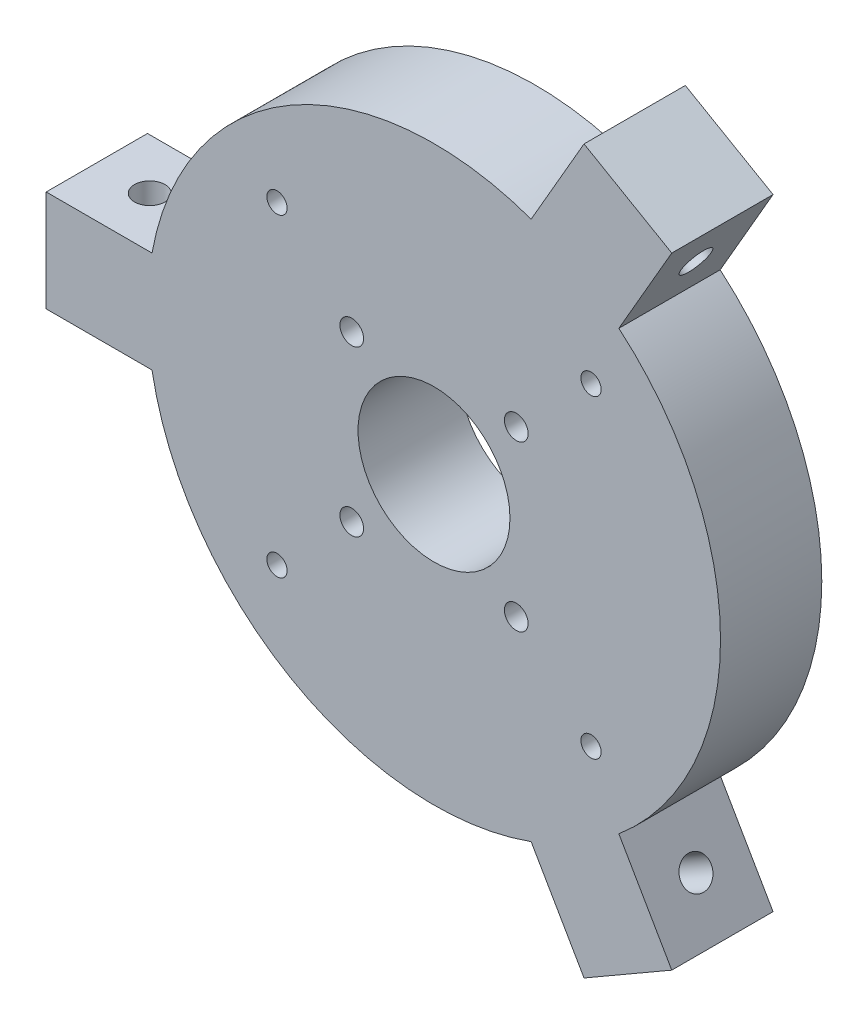
ISO-10303-21;
HEADER;
FILE_DESCRIPTION(('STEP AP214'),'2;1');
FILE_NAME('part.step','',(''),(''),'','','');
FILE_SCHEMA(('AUTOMOTIVE_DESIGN { 1 0 10303 214 1 1 1 1 }'));
ENDSEC;
DATA;
#1=APPLICATION_CONTEXT('core data for automotive mechanical design processes');
#2=APPLICATION_PROTOCOL_DEFINITION('international standard','automotive_design',2000,#1);
#3=PRODUCT_CONTEXT('',#1,'mechanical');
#4=PRODUCT('Part','Part','',(#3));
#5=PRODUCT_RELATED_PRODUCT_CATEGORY('part','',(#4));
#6=PRODUCT_DEFINITION_FORMATION('','',#4);
#7=PRODUCT_DEFINITION_CONTEXT('part definition',#1,'design');
#8=PRODUCT_DEFINITION('design','',#6,#7);
#9=PRODUCT_DEFINITION_SHAPE('','',#8);
#10=(LENGTH_UNIT() NAMED_UNIT(*) SI_UNIT(.MILLI.,.METRE.));
#11=(NAMED_UNIT(*) PLANE_ANGLE_UNIT() SI_UNIT($,.RADIAN.));
#12=(NAMED_UNIT(*) SI_UNIT($,.STERADIAN.) SOLID_ANGLE_UNIT());
#13=UNCERTAINTY_MEASURE_WITH_UNIT(LENGTH_MEASURE(1.E-05),#10,'distance_accuracy_value','');
#14=(GEOMETRIC_REPRESENTATION_CONTEXT(3) GLOBAL_UNCERTAINTY_ASSIGNED_CONTEXT((#13)) GLOBAL_UNIT_ASSIGNED_CONTEXT((#10,
#11,#12)) REPRESENTATION_CONTEXT('',''));
#15=CARTESIAN_POINT('',(0.,0.,0.));
#16=DIRECTION('',(0.,0.,1.));
#17=DIRECTION('',(1.,0.,0.));
#18=AXIS2_PLACEMENT_3D('',#15,#16,#17);
#19=CARTESIAN_POINT('',(0.,0.,20.));
#20=DIRECTION('',(0.,0.,-1.));
#21=DIRECTION('',(-1.,0.,0.));
#22=AXIS2_PLACEMENT_3D('',#19,#20,#21);
#23=CYLINDRICAL_SURFACE('',#22,56.5685424949238);
#24=DIRECTION('',(0.,0.,-1.));
#25=VECTOR('',#24,1.);
#26=CARTESIAN_POINT('',(36.4990758519941,-43.2182538049651,20.));
#27=LINE('',#26,#25);
#28=CARTESIAN_POINT('',(36.499075851994,-43.2182538049651,20.));
#29=VERTEX_POINT('',#28);
#30=CARTESIAN_POINT('',(36.499075851994,-43.2182538049651,0.));
#31=VERTEX_POINT('',#30);
#32=EDGE_CURVE('E255',#29,#31,#27,.T.);
#33=ORIENTED_EDGE('',*,*,#32,.T.);
#34=CARTESIAN_POINT('',(0.,0.,0.));
#35=DIRECTION('',(0.,0.,-1.));
#36=DIRECTION('',(-1.,0.,0.));
#37=AXIS2_PLACEMENT_3D('',#34,#35,#36);
#38=CIRCLE('',#37,56.5685424949238);
#39=CARTESIAN_POINT('',(36.4990758519947,43.2182538049646,0.));
#40=VERTEX_POINT('',#39);
#41=EDGE_CURVE('E433',#40,#31,#38,.T.);
#42=ORIENTED_EDGE('',*,*,#41,.F.);
#43=DIRECTION('',(0.,0.,-1.));
#44=VECTOR('',#43,1.);
#45=CARTESIAN_POINT('',(36.4990758519947,43.2182538049646,20.));
#46=LINE('',#45,#44);
#47=CARTESIAN_POINT('',(36.4990758519946,43.2182538049647,20.));
#48=VERTEX_POINT('',#47);
#49=EDGE_CURVE('E387',#48,#40,#46,.T.);
#50=ORIENTED_EDGE('',*,*,#49,.F.);
#51=CARTESIAN_POINT('',(0.,0.,20.));
#52=DIRECTION('',(0.,0.,-1.));
#53=DIRECTION('',(-1.,0.,0.));
#54=AXIS2_PLACEMENT_3D('',#51,#52,#53);
#55=CIRCLE('',#54,56.5685424949238);
#56=EDGE_CURVE('E428',#48,#29,#55,.T.);
#57=ORIENTED_EDGE('',*,*,#56,.T.);
#58=EDGE_LOOP('',(#33,#42,#50,#57));
#59=FACE_BOUND('',#58,.T.);
#60=ADVANCED_FACE('F238',(#59),#23,.T.);
#61=DIRECTION('',(0.,0.,-1.));
#62=VECTOR('',#61,1.);
#63=CARTESIAN_POINT('',(19.178567776306,53.2182538049647,20.));
#64=LINE('',#63,#62);
#65=CARTESIAN_POINT('',(19.1785677763061,53.2182538049646,20.));
#66=VERTEX_POINT('',#65);
#67=CARTESIAN_POINT('',(19.1785677763061,53.2182538049646,0.));
#68=VERTEX_POINT('',#67);
#69=EDGE_CURVE('E384',#66,#68,#64,.T.);
#70=ORIENTED_EDGE('',*,*,#69,.T.);
#71=CARTESIAN_POINT('',(-55.6776436283002,9.99999999999997,0.));
#72=VERTEX_POINT('',#71);
#73=EDGE_CURVE('E430',#72,#68,#38,.T.);
#74=ORIENTED_EDGE('',*,*,#73,.F.);
#75=DIRECTION('',(0.,0.,-1.));
#76=VECTOR('',#75,1.);
#77=CARTESIAN_POINT('',(-55.6776436283002,9.99999999999997,20.));
#78=LINE('',#77,#76);
#79=CARTESIAN_POINT('',(-55.6776436283002,9.99999999999997,20.));
#80=VERTEX_POINT('',#79);
#81=EDGE_CURVE('E418',#80,#72,#78,.T.);
#82=ORIENTED_EDGE('',*,*,#81,.F.);
#83=EDGE_CURVE('E425',#80,#66,#55,.T.);
#84=ORIENTED_EDGE('',*,*,#83,.T.);
#85=EDGE_LOOP('',(#70,#74,#82,#84));
#86=FACE_BOUND('',#85,.T.);
#87=ADVANCED_FACE('F514',(#86),#23,.T.);
#88=CARTESIAN_POINT('',(0.,0.,20.));
#89=DIRECTION('',(0.,0.,1.));
#90=DIRECTION('',(1.,0.,0.));
#91=AXIS2_PLACEMENT_3D('',#88,#89,#90);
#92=PLANE('',#91);
#93=CARTESIAN_POINT('',(19.1785677763053,-53.2182538049649,20.));
#94=VERTEX_POINT('',#93);
#95=CARTESIAN_POINT('',(-55.6776436283002,-9.99999999999997,20.));
#96=VERTEX_POINT('',#95);
#97=EDGE_CURVE('E429',#94,#96,#55,.T.);
#98=ORIENTED_EDGE('',*,*,#97,.F.);
#99=DIRECTION('',(-0.499999999999992,0.866025403784443,0.));
#100=VECTOR('',#99,1.);
#101=CARTESIAN_POINT('',(-8.66025403784443,-4.99999999999992,20.));
#102=LINE('',#101,#100);
#103=CARTESIAN_POINT('',(29.6240172096168,-71.3103029313526,20.));
#104=VERTEX_POINT('',#103);
#105=EDGE_CURVE('E338',#104,#94,#102,.T.);
#106=ORIENTED_EDGE('',*,*,#105,.F.);
#107=DIRECTION('',(0.866025403784443,0.499999999999992,0.));
#108=VECTOR('',#107,1.);
#109=CARTESIAN_POINT('',(38.2842712474613,-66.3103029313527,20.));
#110=LINE('',#109,#108);
#111=CARTESIAN_POINT('',(46.9445252853057,-61.3103029313528,20.));
#112=VERTEX_POINT('',#111);
#113=EDGE_CURVE('E330',#104,#112,#110,.T.);
#114=ORIENTED_EDGE('',*,*,#113,.T.);
#115=DIRECTION('',(-0.499999999999992,0.866025403784443,0.));
#116=VECTOR('',#115,1.);
#117=CARTESIAN_POINT('',(8.66025403784443,4.99999999999992,20.));
#118=LINE('',#117,#116);
#119=EDGE_CURVE('E336',#112,#29,#118,.T.);
#120=ORIENTED_EDGE('',*,*,#119,.T.);
#121=ORIENTED_EDGE('',*,*,#56,.F.);
#122=DIRECTION('',(-0.500000000000004,-0.866025403784436,0.));
#123=VECTOR('',#122,1.);
#124=CARTESIAN_POINT('',(8.66025403784437,-5.00000000000004,20.));
#125=LINE('',#124,#123);
#126=CARTESIAN_POINT('',(46.9445252853066,61.3103029313521,20.));
#127=VERTEX_POINT('',#126);
#128=EDGE_CURVE('E374',#127,#48,#125,.T.);
#129=ORIENTED_EDGE('',*,*,#128,.F.);
#130=DIRECTION('',(-0.866025403784436,0.500000000000004,0.));
#131=VECTOR('',#130,1.);
#132=CARTESIAN_POINT('',(38.2842712474622,66.3103029313522,20.));
#133=LINE('',#132,#131);
#134=CARTESIAN_POINT('',(29.6240172096178,71.3103029313522,20.));
#135=VERTEX_POINT('',#134);
#136=EDGE_CURVE('E371',#127,#135,#133,.T.);
#137=ORIENTED_EDGE('',*,*,#136,.T.);
#138=DIRECTION('',(-0.500000000000004,-0.866025403784436,0.));
#139=VECTOR('',#138,1.);
#140=CARTESIAN_POINT('',(-8.66025403784437,5.00000000000004,20.));
#141=LINE('',#140,#139);
#142=EDGE_CURVE('E368',#135,#66,#141,.T.);
#143=ORIENTED_EDGE('',*,*,#142,.T.);
#144=ORIENTED_EDGE('',*,*,#83,.F.);
#145=DIRECTION('',(1.,0.,0.));
#146=VECTOR('',#145,1.);
#147=CARTESIAN_POINT('',(0.,10.,20.));
#148=LINE('',#147,#146);
#149=CARTESIAN_POINT('',(-76.5685424949238,10.,20.));
#150=VERTEX_POINT('',#149);
#151=EDGE_CURVE('E403',#150,#80,#148,.T.);
#152=ORIENTED_EDGE('',*,*,#151,.F.);
#153=DIRECTION('',(0.,-1.,0.));
#154=VECTOR('',#153,1.);
#155=CARTESIAN_POINT('',(-76.5685424949238,0.,20.));
#156=LINE('',#155,#154);
#157=CARTESIAN_POINT('',(-76.5685424949238,-10.,20.));
#158=VERTEX_POINT('',#157);
#159=EDGE_CURVE('E400',#150,#158,#156,.T.);
#160=ORIENTED_EDGE('',*,*,#159,.T.);
#161=DIRECTION('',(1.,0.,0.));
#162=VECTOR('',#161,1.);
#163=CARTESIAN_POINT('',(0.,-10.,20.));
#164=LINE('',#163,#162);
#165=EDGE_CURVE('E397',#158,#96,#164,.T.);
#166=ORIENTED_EDGE('',*,*,#165,.T.);
#167=EDGE_LOOP('',(#98,#106,#114,#120,#121,#129,#137,#143,#144,#152,#160,#166));
#168=FACE_BOUND('',#167,.T.);
#169=CARTESIAN_POINT('',(16.24,-16.2400000000001,20.));
#170=DIRECTION('',(0.,0.,1.));
#171=DIRECTION('',(0.,-1.,0.));
#172=AXIS2_PLACEMENT_3D('',#169,#170,#171);
#173=CIRCLE('',#172,2.34);
#174=CARTESIAN_POINT('',(16.2399999999999,-18.58,20.));
#175=VERTEX_POINT('',#174);
#176=EDGE_CURVE('E438',#175,#175,#173,.T.);
#177=ORIENTED_EDGE('',*,*,#176,.F.);
#178=EDGE_LOOP('',(#177));
#179=FACE_BOUND('',#178,.T.);
#180=CARTESIAN_POINT('',(-16.24,-16.24,20.));
#181=DIRECTION('',(0.,0.,1.));
#182=DIRECTION('',(-1.,0.,0.));
#183=AXIS2_PLACEMENT_3D('',#180,#181,#182);
#184=CIRCLE('',#183,2.34);
#185=CARTESIAN_POINT('',(-18.58,-16.24,20.));
#186=VERTEX_POINT('',#185);
#187=EDGE_CURVE('E444',#186,#186,#184,.T.);
#188=ORIENTED_EDGE('',*,*,#187,.F.);
#189=EDGE_LOOP('',(#188));
#190=FACE_BOUND('',#189,.T.);
#191=CARTESIAN_POINT('',(-16.2399999999998,16.2400000000002,20.));
#192=DIRECTION('',(0.,0.,1.));
#193=DIRECTION('',(0.,1.,0.));
#194=AXIS2_PLACEMENT_3D('',#191,#192,#193);
#195=CIRCLE('',#194,2.34);
#196=CARTESIAN_POINT('',(-16.2399999999998,18.5800000000002,20.));
#197=VERTEX_POINT('',#196);
#198=EDGE_CURVE('E427',#197,#197,#195,.T.);
#199=ORIENTED_EDGE('',*,*,#198,.F.);
#200=EDGE_LOOP('',(#199));
#201=FACE_BOUND('',#200,.T.);
#202=CARTESIAN_POINT('',(16.24,16.24,20.));
#203=DIRECTION('',(0.,0.,1.));
#204=DIRECTION('',(1.,0.,0.));
#205=AXIS2_PLACEMENT_3D('',#202,#203,#204);
#206=CIRCLE('',#205,2.34);
#207=CARTESIAN_POINT('',(18.58,16.24,20.));
#208=VERTEX_POINT('',#207);
#209=EDGE_CURVE('E437',#208,#208,#206,.T.);
#210=ORIENTED_EDGE('',*,*,#209,.F.);
#211=EDGE_LOOP('',(#210));
#212=FACE_BOUND('',#211,.T.);
#213=CARTESIAN_POINT('',(-31.0000000000001,30.9999999999999,20.));
#214=DIRECTION('',(0.,0.,1.));
#215=DIRECTION('',(0.,1.,0.));
#216=AXIS2_PLACEMENT_3D('',#213,#214,#215);
#217=CIRCLE('',#216,2.);
#218=CARTESIAN_POINT('',(-31.0000000000001,32.9999999999999,20.));
#219=VERTEX_POINT('',#218);
#220=EDGE_CURVE('E462',#219,#219,#217,.T.);
#221=ORIENTED_EDGE('',*,*,#220,.F.);
#222=EDGE_LOOP('',(#221));
#223=FACE_BOUND('',#222,.T.);
#224=CARTESIAN_POINT('',(-31.,-31.,20.));
#225=DIRECTION('',(0.,0.,1.));
#226=DIRECTION('',(-1.,0.,0.));
#227=AXIS2_PLACEMENT_3D('',#224,#225,#226);
#228=CIRCLE('',#227,2.);
#229=CARTESIAN_POINT('',(-33.,-31.,20.));
#230=VERTEX_POINT('',#229);
#231=EDGE_CURVE('E468',#230,#230,#228,.T.);
#232=ORIENTED_EDGE('',*,*,#231,.F.);
#233=EDGE_LOOP('',(#232));
#234=FACE_BOUND('',#233,.T.);
#235=CARTESIAN_POINT('',(31.0000000000003,-30.9999999999997,20.));
#236=DIRECTION('',(0.,0.,1.));
#237=DIRECTION('',(0.,-1.,0.));
#238=AXIS2_PLACEMENT_3D('',#235,#236,#237);
#239=CIRCLE('',#238,2.);
#240=CARTESIAN_POINT('',(31.0000000000004,-32.9999999999997,20.));
#241=VERTEX_POINT('',#240);
#242=EDGE_CURVE('E455',#241,#241,#239,.T.);
#243=ORIENTED_EDGE('',*,*,#242,.F.);
#244=EDGE_LOOP('',(#243));
#245=FACE_BOUND('',#244,.T.);
#246=CARTESIAN_POINT('',(31.,31.,20.));
#247=DIRECTION('',(0.,0.,1.));
#248=DIRECTION('',(1.,0.,0.));
#249=AXIS2_PLACEMENT_3D('',#246,#247,#248);
#250=CIRCLE('',#249,2.);
#251=CARTESIAN_POINT('',(33.,31.,20.));
#252=VERTEX_POINT('',#251);
#253=EDGE_CURVE('E461',#252,#252,#250,.T.);
#254=ORIENTED_EDGE('',*,*,#253,.F.);
#255=EDGE_LOOP('',(#254));
#256=FACE_BOUND('',#255,.T.);
#257=CARTESIAN_POINT('',(0.,0.,20.));
#258=DIRECTION('',(0.,0.,1.));
#259=DIRECTION('',(1.,0.,0.));
#260=AXIS2_PLACEMENT_3D('',#257,#258,#259);
#261=CIRCLE('',#260,15.);
#262=CARTESIAN_POINT('',(15.,0.,20.));
#263=VERTEX_POINT('',#262);
#264=EDGE_CURVE('E247',#263,#263,#261,.T.);
#265=ORIENTED_EDGE('',*,*,#264,.F.);
#266=EDGE_LOOP('',(#265));
#267=FACE_BOUND('',#266,.T.);
#268=ADVANCED_FACE('F332',(#168,#179,#190,#201,#212,#223,#234,#245,#256,#267),#92,.T.);
#269=CARTESIAN_POINT('',(0.,0.,0.));
#270=DIRECTION('',(0.,0.,1.));
#271=DIRECTION('',(1.,0.,0.));
#272=AXIS2_PLACEMENT_3D('',#269,#270,#271);
#273=PLANE('',#272);
#274=CARTESIAN_POINT('',(16.24,-16.2400000000001,0.));
#275=DIRECTION('',(0.,0.,1.));
#276=DIRECTION('',(0.,-1.,0.));
#277=AXIS2_PLACEMENT_3D('',#274,#275,#276);
#278=CIRCLE('',#277,2.34);
#279=CARTESIAN_POINT('',(16.2399999999999,-18.58,0.));
#280=VERTEX_POINT('',#279);
#281=EDGE_CURVE('E434',#280,#280,#278,.T.);
#282=ORIENTED_EDGE('',*,*,#281,.T.);
#283=EDGE_LOOP('',(#282));
#284=FACE_BOUND('',#283,.T.);
#285=CARTESIAN_POINT('',(-16.24,-16.24,0.));
#286=DIRECTION('',(0.,0.,1.));
#287=DIRECTION('',(-1.,0.,0.));
#288=AXIS2_PLACEMENT_3D('',#285,#286,#287);
#289=CIRCLE('',#288,2.34);
#290=CARTESIAN_POINT('',(-18.58,-16.24,0.));
#291=VERTEX_POINT('',#290);
#292=EDGE_CURVE('E441',#291,#291,#289,.T.);
#293=ORIENTED_EDGE('',*,*,#292,.T.);
#294=EDGE_LOOP('',(#293));
#295=FACE_BOUND('',#294,.T.);
#296=CARTESIAN_POINT('',(-16.2399999999998,16.2400000000002,0.));
#297=DIRECTION('',(0.,0.,1.));
#298=DIRECTION('',(0.,1.,0.));
#299=AXIS2_PLACEMENT_3D('',#296,#297,#298);
#300=CIRCLE('',#299,2.34);
#301=CARTESIAN_POINT('',(-16.2399999999998,18.5800000000002,0.));
#302=VERTEX_POINT('',#301);
#303=EDGE_CURVE('E447',#302,#302,#300,.T.);
#304=ORIENTED_EDGE('',*,*,#303,.T.);
#305=EDGE_LOOP('',(#304));
#306=FACE_BOUND('',#305,.T.);
#307=CARTESIAN_POINT('',(16.24,16.24,0.));
#308=DIRECTION('',(0.,0.,1.));
#309=DIRECTION('',(1.,0.,0.));
#310=AXIS2_PLACEMENT_3D('',#307,#308,#309);
#311=CIRCLE('',#310,2.34);
#312=CARTESIAN_POINT('',(18.58,16.24,0.));
#313=VERTEX_POINT('',#312);
#314=EDGE_CURVE('E452',#313,#313,#311,.T.);
#315=ORIENTED_EDGE('',*,*,#314,.T.);
#316=EDGE_LOOP('',(#315));
#317=FACE_BOUND('',#316,.T.);
#318=CARTESIAN_POINT('',(-31.0000000000001,30.9999999999999,0.));
#319=DIRECTION('',(0.,0.,1.));
#320=DIRECTION('',(0.,1.,0.));
#321=AXIS2_PLACEMENT_3D('',#318,#319,#320);
#322=CIRCLE('',#321,2.);
#323=CARTESIAN_POINT('',(-31.0000000000001,32.9999999999999,0.));
#324=VERTEX_POINT('',#323);
#325=EDGE_CURVE('E458',#324,#324,#322,.T.);
#326=ORIENTED_EDGE('',*,*,#325,.T.);
#327=EDGE_LOOP('',(#326));
#328=FACE_BOUND('',#327,.T.);
#329=CARTESIAN_POINT('',(-31.,-31.,0.));
#330=DIRECTION('',(0.,0.,1.));
#331=DIRECTION('',(-1.,0.,0.));
#332=AXIS2_PLACEMENT_3D('',#329,#330,#331);
#333=CIRCLE('',#332,2.);
#334=CARTESIAN_POINT('',(-33.,-31.,0.));
#335=VERTEX_POINT('',#334);
#336=EDGE_CURVE('E465',#335,#335,#333,.T.);
#337=ORIENTED_EDGE('',*,*,#336,.T.);
#338=EDGE_LOOP('',(#337));
#339=FACE_BOUND('',#338,.T.);
#340=CARTESIAN_POINT('',(31.0000000000003,-30.9999999999997,0.));
#341=DIRECTION('',(0.,0.,1.));
#342=DIRECTION('',(0.,-1.,0.));
#343=AXIS2_PLACEMENT_3D('',#340,#341,#342);
#344=CIRCLE('',#343,2.);
#345=CARTESIAN_POINT('',(31.0000000000004,-32.9999999999997,0.));
#346=VERTEX_POINT('',#345);
#347=EDGE_CURVE('E471',#346,#346,#344,.T.);
#348=ORIENTED_EDGE('',*,*,#347,.T.);
#349=EDGE_LOOP('',(#348));
#350=FACE_BOUND('',#349,.T.);
#351=CARTESIAN_POINT('',(31.,31.,0.));
#352=DIRECTION('',(0.,0.,1.));
#353=DIRECTION('',(1.,0.,0.));
#354=AXIS2_PLACEMENT_3D('',#351,#352,#353);
#355=CIRCLE('',#354,2.);
#356=CARTESIAN_POINT('',(33.,31.,0.));
#357=VERTEX_POINT('',#356);
#358=EDGE_CURVE('E476',#357,#357,#355,.T.);
#359=ORIENTED_EDGE('',*,*,#358,.T.);
#360=EDGE_LOOP('',(#359));
#361=FACE_BOUND('',#360,.T.);
#362=CARTESIAN_POINT('',(0.,0.,0.));
#363=DIRECTION('',(0.,0.,1.));
#364=DIRECTION('',(1.,0.,0.));
#365=AXIS2_PLACEMENT_3D('',#362,#363,#364);
#366=CIRCLE('',#365,15.);
#367=CARTESIAN_POINT('',(15.,0.,0.));
#368=VERTEX_POINT('',#367);
#369=EDGE_CURVE('E12',#368,#368,#366,.T.);
#370=ORIENTED_EDGE('',*,*,#369,.T.);
#371=EDGE_LOOP('',(#370));
#372=FACE_BOUND('',#371,.T.);
#373=ORIENTED_EDGE('',*,*,#41,.T.);
#374=DIRECTION('',(-0.499999999999992,0.866025403784443,0.));
#375=VECTOR('',#374,1.);
#376=CARTESIAN_POINT('',(8.66025403784443,4.99999999999992,0.));
#377=LINE('',#376,#375);
#378=CARTESIAN_POINT('',(46.9445252853057,-61.3103029313528,0.));
#379=VERTEX_POINT('',#378);
#380=EDGE_CURVE('E361',#379,#31,#377,.T.);
#381=ORIENTED_EDGE('',*,*,#380,.F.);
#382=DIRECTION('',(0.866025403784443,0.499999999999992,0.));
#383=VECTOR('',#382,1.);
#384=CARTESIAN_POINT('',(38.2842712474613,-66.3103029313527,0.));
#385=LINE('',#384,#383);
#386=CARTESIAN_POINT('',(29.6240172096168,-71.3103029313526,0.));
#387=VERTEX_POINT('',#386);
#388=EDGE_CURVE('E345',#387,#379,#385,.T.);
#389=ORIENTED_EDGE('',*,*,#388,.F.);
#390=DIRECTION('',(-0.499999999999992,0.866025403784443,0.));
#391=VECTOR('',#390,1.);
#392=CARTESIAN_POINT('',(-8.66025403784443,-4.99999999999992,0.));
#393=LINE('',#392,#391);
#394=CARTESIAN_POINT('',(19.1785677763053,-53.2182538049649,0.));
#395=VERTEX_POINT('',#394);
#396=EDGE_CURVE('E352',#387,#395,#393,.T.);
#397=ORIENTED_EDGE('',*,*,#396,.T.);
#398=CARTESIAN_POINT('',(-55.6776436283002,-9.99999999999997,0.));
#399=VERTEX_POINT('',#398);
#400=EDGE_CURVE('E417',#395,#399,#38,.T.);
#401=ORIENTED_EDGE('',*,*,#400,.T.);
#402=DIRECTION('',(1.,0.,0.));
#403=VECTOR('',#402,1.);
#404=CARTESIAN_POINT('',(0.,-10.,0.));
#405=LINE('',#404,#403);
#406=CARTESIAN_POINT('',(-76.5685424949238,-10.,0.));
#407=VERTEX_POINT('',#406);
#408=EDGE_CURVE('E407',#407,#399,#405,.T.);
#409=ORIENTED_EDGE('',*,*,#408,.F.);
#410=DIRECTION('',(0.,-1.,0.));
#411=VECTOR('',#410,1.);
#412=CARTESIAN_POINT('',(-76.5685424949238,0.,0.));
#413=LINE('',#412,#411);
#414=CARTESIAN_POINT('',(-76.5685424949238,10.,0.));
#415=VERTEX_POINT('',#414);
#416=EDGE_CURVE('E410',#415,#407,#413,.T.);
#417=ORIENTED_EDGE('',*,*,#416,.F.);
#418=DIRECTION('',(1.,0.,0.));
#419=VECTOR('',#418,1.);
#420=CARTESIAN_POINT('',(0.,10.,0.));
#421=LINE('',#420,#419);
#422=EDGE_CURVE('E401',#415,#72,#421,.T.);
#423=ORIENTED_EDGE('',*,*,#422,.T.);
#424=ORIENTED_EDGE('',*,*,#73,.T.);
#425=DIRECTION('',(-0.500000000000004,-0.866025403784436,0.));
#426=VECTOR('',#425,1.);
#427=CARTESIAN_POINT('',(-8.66025403784437,5.00000000000004,0.));
#428=LINE('',#427,#426);
#429=CARTESIAN_POINT('',(29.6240172096178,71.3103029313522,0.));
#430=VERTEX_POINT('',#429);
#431=EDGE_CURVE('E365',#430,#68,#428,.T.);
#432=ORIENTED_EDGE('',*,*,#431,.F.);
#433=DIRECTION('',(-0.866025403784436,0.500000000000004,0.));
#434=VECTOR('',#433,1.);
#435=CARTESIAN_POINT('',(38.2842712474622,66.3103029313522,0.));
#436=LINE('',#435,#434);
#437=CARTESIAN_POINT('',(46.9445252853066,61.3103029313521,0.));
#438=VERTEX_POINT('',#437);
#439=EDGE_CURVE('E380',#438,#430,#436,.T.);
#440=ORIENTED_EDGE('',*,*,#439,.F.);
#441=DIRECTION('',(-0.500000000000004,-0.866025403784436,0.));
#442=VECTOR('',#441,1.);
#443=CARTESIAN_POINT('',(8.66025403784437,-5.00000000000004,0.));
#444=LINE('',#443,#442);
#445=EDGE_CURVE('E372',#438,#40,#444,.T.);
#446=ORIENTED_EDGE('',*,*,#445,.T.);
#447=EDGE_LOOP('',(#373,#381,#389,#397,#401,#409,#417,#423,#424,#432,#440,#446));
#448=FACE_BOUND('',#447,.T.);
#449=ADVANCED_FACE('F240',(#284,#295,#306,#317,#328,#339,#350,#361,#372,#448),#273,.F.);
#450=CARTESIAN_POINT('',(0.,0.,0.));
#451=DIRECTION('',(0.,0.,1.));
#452=DIRECTION('',(1.,0.,0.));
#453=AXIS2_PLACEMENT_3D('',#450,#451,#452);
#454=CYLINDRICAL_SURFACE('',#453,15.);
#455=ORIENTED_EDGE('',*,*,#369,.F.);
#456=EDGE_LOOP('',(#455));
#457=FACE_BOUND('',#456,.T.);
#458=ORIENTED_EDGE('',*,*,#264,.T.);
#459=EDGE_LOOP('',(#458));
#460=FACE_BOUND('',#459,.T.);
#461=ADVANCED_FACE('F565',(#457,#460),#454,.F.);
#462=CARTESIAN_POINT('',(31.,31.,0.));
#463=DIRECTION('',(0.,0.,1.));
#464=DIRECTION('',(1.,0.,0.));
#465=AXIS2_PLACEMENT_3D('',#462,#463,#464);
#466=CYLINDRICAL_SURFACE('',#465,2.);
#467=ORIENTED_EDGE('',*,*,#358,.F.);
#468=EDGE_LOOP('',(#467));
#469=FACE_BOUND('',#468,.T.);
#470=ORIENTED_EDGE('',*,*,#253,.T.);
#471=EDGE_LOOP('',(#470));
#472=FACE_BOUND('',#471,.T.);
#473=ADVANCED_FACE('F561',(#469,#472),#466,.F.);
#474=CARTESIAN_POINT('',(31.0000000000003,-30.9999999999997,0.));
#475=DIRECTION('',(0.,0.,1.));
#476=DIRECTION('',(1.,0.,0.));
#477=AXIS2_PLACEMENT_3D('',#474,#475,#476);
#478=CYLINDRICAL_SURFACE('',#477,2.);
#479=ORIENTED_EDGE('',*,*,#347,.F.);
#480=EDGE_LOOP('',(#479));
#481=FACE_BOUND('',#480,.T.);
#482=ORIENTED_EDGE('',*,*,#242,.T.);
#483=EDGE_LOOP('',(#482));
#484=FACE_BOUND('',#483,.T.);
#485=ADVANCED_FACE('F557',(#481,#484),#478,.F.);
#486=CARTESIAN_POINT('',(-31.,-31.,0.));
#487=DIRECTION('',(0.,0.,1.));
#488=DIRECTION('',(1.,0.,0.));
#489=AXIS2_PLACEMENT_3D('',#486,#487,#488);
#490=CYLINDRICAL_SURFACE('',#489,2.);
#491=ORIENTED_EDGE('',*,*,#336,.F.);
#492=EDGE_LOOP('',(#491));
#493=FACE_BOUND('',#492,.T.);
#494=ORIENTED_EDGE('',*,*,#231,.T.);
#495=EDGE_LOOP('',(#494));
#496=FACE_BOUND('',#495,.T.);
#497=ADVANCED_FACE('F553',(#493,#496),#490,.F.);
#498=CARTESIAN_POINT('',(-31.0000000000001,30.9999999999999,0.));
#499=DIRECTION('',(0.,0.,1.));
#500=DIRECTION('',(1.,0.,0.));
#501=AXIS2_PLACEMENT_3D('',#498,#499,#500);
#502=CYLINDRICAL_SURFACE('',#501,2.);
#503=ORIENTED_EDGE('',*,*,#325,.F.);
#504=EDGE_LOOP('',(#503));
#505=FACE_BOUND('',#504,.T.);
#506=ORIENTED_EDGE('',*,*,#220,.T.);
#507=EDGE_LOOP('',(#506));
#508=FACE_BOUND('',#507,.T.);
#509=ADVANCED_FACE('F549',(#505,#508),#502,.F.);
#510=CARTESIAN_POINT('',(16.24,16.24,0.));
#511=DIRECTION('',(0.,0.,1.));
#512=DIRECTION('',(1.,0.,0.));
#513=AXIS2_PLACEMENT_3D('',#510,#511,#512);
#514=CYLINDRICAL_SURFACE('',#513,2.34);
#515=ORIENTED_EDGE('',*,*,#314,.F.);
#516=EDGE_LOOP('',(#515));
#517=FACE_BOUND('',#516,.T.);
#518=ORIENTED_EDGE('',*,*,#209,.T.);
#519=EDGE_LOOP('',(#518));
#520=FACE_BOUND('',#519,.T.);
#521=ADVANCED_FACE('F545',(#517,#520),#514,.F.);
#522=CARTESIAN_POINT('',(-16.2399999999998,16.2400000000002,0.));
#523=DIRECTION('',(0.,0.,1.));
#524=DIRECTION('',(1.,0.,0.));
#525=AXIS2_PLACEMENT_3D('',#522,#523,#524);
#526=CYLINDRICAL_SURFACE('',#525,2.34);
#527=ORIENTED_EDGE('',*,*,#303,.F.);
#528=EDGE_LOOP('',(#527));
#529=FACE_BOUND('',#528,.T.);
#530=ORIENTED_EDGE('',*,*,#198,.T.);
#531=EDGE_LOOP('',(#530));
#532=FACE_BOUND('',#531,.T.);
#533=ADVANCED_FACE('F537',(#529,#532),#526,.F.);
#534=CARTESIAN_POINT('',(-16.24,-16.24,0.));
#535=DIRECTION('',(0.,0.,1.));
#536=DIRECTION('',(1.,0.,0.));
#537=AXIS2_PLACEMENT_3D('',#534,#535,#536);
#538=CYLINDRICAL_SURFACE('',#537,2.34);
#539=ORIENTED_EDGE('',*,*,#292,.F.);
#540=EDGE_LOOP('',(#539));
#541=FACE_BOUND('',#540,.T.);
#542=ORIENTED_EDGE('',*,*,#187,.T.);
#543=EDGE_LOOP('',(#542));
#544=FACE_BOUND('',#543,.T.);
#545=ADVANCED_FACE('F532',(#541,#544),#538,.F.);
#546=CARTESIAN_POINT('',(16.24,-16.2400000000001,0.));
#547=DIRECTION('',(0.,0.,1.));
#548=DIRECTION('',(1.,0.,0.));
#549=AXIS2_PLACEMENT_3D('',#546,#547,#548);
#550=CYLINDRICAL_SURFACE('',#549,2.34);
#551=ORIENTED_EDGE('',*,*,#281,.F.);
#552=EDGE_LOOP('',(#551));
#553=FACE_BOUND('',#552,.T.);
#554=ORIENTED_EDGE('',*,*,#176,.T.);
#555=EDGE_LOOP('',(#554));
#556=FACE_BOUND('',#555,.T.);
#557=ADVANCED_FACE('F525',(#553,#556),#550,.F.);
#558=DIRECTION('',(0.,0.,-1.));
#559=VECTOR('',#558,1.);
#560=CARTESIAN_POINT('',(19.1785677763053,-53.2182538049649,20.));
#561=LINE('',#560,#559);
#562=EDGE_CURVE('E263',#94,#395,#561,.T.);
#563=ORIENTED_EDGE('',*,*,#562,.F.);
#564=ORIENTED_EDGE('',*,*,#97,.T.);
#565=DIRECTION('',(0.,0.,-1.));
#566=VECTOR('',#565,1.);
#567=CARTESIAN_POINT('',(-55.6776436283002,-9.99999999999997,20.));
#568=LINE('',#567,#566);
#569=EDGE_CURVE('E414',#96,#399,#568,.T.);
#570=ORIENTED_EDGE('',*,*,#569,.T.);
#571=ORIENTED_EDGE('',*,*,#400,.F.);
#572=EDGE_LOOP('',(#563,#564,#570,#571));
#573=FACE_BOUND('',#572,.T.);
#574=ADVANCED_FACE('F516',(#573),#23,.T.);
#575=CARTESIAN_POINT('',(0.,-10.,20.));
#576=DIRECTION('',(0.,1.,0.));
#577=DIRECTION('',(0.,0.,1.));
#578=AXIS2_PLACEMENT_3D('',#575,#576,#577);
#579=PLANE('',#578);
#580=CARTESIAN_POINT('',(-66.123093061612,-10.,10.));
#581=DIRECTION('',(0.,-1.,0.));
#582=DIRECTION('',(0.,0.,-1.));
#583=AXIS2_PLACEMENT_3D('',#580,#581,#582);
#584=CIRCLE('',#583,3.00000000000001);
#585=CARTESIAN_POINT('',(-66.123093061612,-10.,6.99999999999999));
#586=VERTEX_POINT('',#585);
#587=EDGE_CURVE('E386',#586,#586,#584,.T.);
#588=ORIENTED_EDGE('',*,*,#587,.F.);
#589=EDGE_LOOP('',(#588));
#590=FACE_BOUND('',#589,.T.);
#591=ORIENTED_EDGE('',*,*,#408,.T.);
#592=ORIENTED_EDGE('',*,*,#569,.F.);
#593=ORIENTED_EDGE('',*,*,#165,.F.);
#594=DIRECTION('',(0.,0.,-1.));
#595=VECTOR('',#594,1.);
#596=CARTESIAN_POINT('',(-76.5685424949238,-10.,20.));
#597=LINE('',#596,#595);
#598=EDGE_CURVE('E406',#158,#407,#597,.T.);
#599=ORIENTED_EDGE('',*,*,#598,.T.);
#600=EDGE_LOOP('',(#591,#592,#593,#599));
#601=FACE_BOUND('',#600,.T.);
#602=ADVANCED_FACE('F524',(#590,#601),#579,.F.);
#603=CARTESIAN_POINT('',(-76.5685424949238,0.,20.));
#604=DIRECTION('',(1.,0.,0.));
#605=DIRECTION('',(0.,0.,-1.));
#606=AXIS2_PLACEMENT_3D('',#603,#604,#605);
#607=PLANE('',#606);
#608=ORIENTED_EDGE('',*,*,#416,.T.);
#609=ORIENTED_EDGE('',*,*,#598,.F.);
#610=ORIENTED_EDGE('',*,*,#159,.F.);
#611=DIRECTION('',(0.,0.,-1.));
#612=VECTOR('',#611,1.);
#613=CARTESIAN_POINT('',(-76.5685424949238,10.,20.));
#614=LINE('',#613,#612);
#615=EDGE_CURVE('E421',#150,#415,#614,.T.);
#616=ORIENTED_EDGE('',*,*,#615,.T.);
#617=EDGE_LOOP('',(#608,#609,#610,#616));
#618=FACE_BOUND('',#617,.T.);
#619=ADVANCED_FACE('F530',(#618),#607,.F.);
#620=CARTESIAN_POINT('',(0.,10.,20.));
#621=DIRECTION('',(0.,1.,0.));
#622=DIRECTION('',(0.,0.,1.));
#623=AXIS2_PLACEMENT_3D('',#620,#621,#622);
#624=PLANE('',#623);
#625=CARTESIAN_POINT('',(-66.123093061612,10.,10.));
#626=DIRECTION('',(0.,1.,0.));
#627=DIRECTION('',(0.,0.,1.));
#628=AXIS2_PLACEMENT_3D('',#625,#626,#627);
#629=CIRCLE('',#628,3.00000000000001);
#630=CARTESIAN_POINT('',(-66.123093061612,10.,13.));
#631=VERTEX_POINT('',#630);
#632=EDGE_CURVE('E396',#631,#631,#629,.T.);
#633=ORIENTED_EDGE('',*,*,#632,.F.);
#634=EDGE_LOOP('',(#633));
#635=FACE_BOUND('',#634,.T.);
#636=ORIENTED_EDGE('',*,*,#422,.F.);
#637=ORIENTED_EDGE('',*,*,#615,.F.);
#638=ORIENTED_EDGE('',*,*,#151,.T.);
#639=ORIENTED_EDGE('',*,*,#81,.T.);
#640=EDGE_LOOP('',(#636,#637,#638,#639));
#641=FACE_BOUND('',#640,.T.);
#642=ADVANCED_FACE('F607',(#635,#641),#624,.T.);
#643=CARTESIAN_POINT('',(-66.123093061612,56.5685424949238,10.));
#644=DIRECTION('',(0.,-1.,0.));
#645=DIRECTION('',(0.,0.,-1.));
#646=AXIS2_PLACEMENT_3D('',#643,#644,#645);
#647=CYLINDRICAL_SURFACE('',#646,3.00000000000001);
#648=ORIENTED_EDGE('',*,*,#632,.T.);
#649=EDGE_LOOP('',(#648));
#650=FACE_BOUND('',#649,.T.);
#651=ORIENTED_EDGE('',*,*,#587,.T.);
#652=EDGE_LOOP('',(#651));
#653=FACE_BOUND('',#652,.T.);
#654=ADVANCED_FACE('F623',(#650,#653),#647,.F.);
#655=CARTESIAN_POINT('',(-8.66025403784437,5.00000000000004,20.));
#656=DIRECTION('',(0.866025403784436,-0.500000000000004,0.));
#657=DIRECTION('',(0.500000000000004,0.866025403784436,0.));
#658=AXIS2_PLACEMENT_3D('',#655,#656,#657);
#659=PLANE('',#658);
#660=CARTESIAN_POINT('',(24.4012924929619,62.2642783681584,10.));
#661=DIRECTION('',(-0.866025403784436,0.500000000000004,0.));
#662=DIRECTION('',(0.,0.,-1.));
#663=AXIS2_PLACEMENT_3D('',#660,#661,#662);
#664=CIRCLE('',#663,3.00000000000001);
#665=CARTESIAN_POINT('',(24.4012924929619,62.2642783681584,6.99999999999999));
#666=VERTEX_POINT('',#665);
#667=EDGE_CURVE('E486',#666,#666,#664,.T.);
#668=ORIENTED_EDGE('',*,*,#667,.F.);
#669=EDGE_LOOP('',(#668));
#670=FACE_BOUND('',#669,.T.);
#671=ORIENTED_EDGE('',*,*,#431,.T.);
#672=ORIENTED_EDGE('',*,*,#69,.F.);
#673=ORIENTED_EDGE('',*,*,#142,.F.);
#674=DIRECTION('',(0.,0.,-1.));
#675=VECTOR('',#674,1.);
#676=CARTESIAN_POINT('',(29.6240172096178,71.3103029313522,20.));
#677=LINE('',#676,#675);
#678=EDGE_CURVE('E377',#135,#430,#677,.T.);
#679=ORIENTED_EDGE('',*,*,#678,.T.);
#680=EDGE_LOOP('',(#671,#672,#673,#679));
#681=FACE_BOUND('',#680,.T.);
#682=ADVANCED_FACE('F615',(#670,#681),#659,.F.);
#683=CARTESIAN_POINT('',(8.66025403784437,-5.00000000000004,20.));
#684=DIRECTION('',(0.866025403784436,-0.500000000000004,0.));
#685=DIRECTION('',(0.500000000000004,0.866025403784436,0.));
#686=AXIS2_PLACEMENT_3D('',#683,#684,#685);
#687=PLANE('',#686);
#688=CARTESIAN_POINT('',(41.7218005686506,52.2642783681584,10.));
#689=DIRECTION('',(0.866025403784436,-0.500000000000004,0.));
#690=DIRECTION('',(0.500000000000004,0.866025403784436,0.));
#691=AXIS2_PLACEMENT_3D('',#688,#689,#690);
#692=CIRCLE('',#691,3.00000000000001);
#693=CARTESIAN_POINT('',(43.2218005686506,54.8623545795117,10.));
#694=VERTEX_POINT('',#693);
#695=EDGE_CURVE('E242',#694,#694,#692,.T.);
#696=ORIENTED_EDGE('',*,*,#695,.F.);
#697=EDGE_LOOP('',(#696));
#698=FACE_BOUND('',#697,.T.);
#699=ORIENTED_EDGE('',*,*,#445,.F.);
#700=DIRECTION('',(0.,0.,-1.));
#701=VECTOR('',#700,1.);
#702=CARTESIAN_POINT('',(46.9445252853066,61.3103029313521,20.));
#703=LINE('',#702,#701);
#704=EDGE_CURVE('E390',#127,#438,#703,.T.);
#705=ORIENTED_EDGE('',*,*,#704,.F.);
#706=ORIENTED_EDGE('',*,*,#128,.T.);
#707=ORIENTED_EDGE('',*,*,#49,.T.);
#708=EDGE_LOOP('',(#699,#705,#706,#707));
#709=FACE_BOUND('',#708,.T.);
#710=ADVANCED_FACE('F508',(#698,#709),#687,.T.);
#711=CARTESIAN_POINT('',(38.2842712474622,66.3103029313522,20.));
#712=DIRECTION('',(-0.500000000000004,-0.866025403784436,0.));
#713=DIRECTION('',(0.866025403784436,-0.500000000000004,0.));
#714=AXIS2_PLACEMENT_3D('',#711,#712,#713);
#715=PLANE('',#714);
#716=ORIENTED_EDGE('',*,*,#439,.T.);
#717=ORIENTED_EDGE('',*,*,#678,.F.);
#718=ORIENTED_EDGE('',*,*,#136,.F.);
#719=ORIENTED_EDGE('',*,*,#704,.T.);
#720=EDGE_LOOP('',(#716,#717,#718,#719));
#721=FACE_BOUND('',#720,.T.);
#722=ADVANCED_FACE('F500',(#721),#715,.F.);
#723=CARTESIAN_POINT('',(8.66025403784443,4.99999999999992,20.));
#724=DIRECTION('',(-0.866025403784443,-0.499999999999992,0.));
#725=DIRECTION('',(0.499999999999992,-0.866025403784443,0.));
#726=AXIS2_PLACEMENT_3D('',#723,#724,#725);
#727=PLANE('',#726);
#728=CARTESIAN_POINT('',(41.7218005686499,-52.2642783681589,10.));
#729=DIRECTION('',(0.866025403784443,0.499999999999992,0.));
#730=DIRECTION('',(0.,0.,-1.));
#731=AXIS2_PLACEMENT_3D('',#728,#729,#730);
#732=CIRCLE('',#731,3.00000000000001);
#733=CARTESIAN_POINT('',(41.7218005686499,-52.2642783681589,6.99999999999999));
#734=VERTEX_POINT('',#733);
#735=EDGE_CURVE('E357',#734,#734,#732,.T.);
#736=ORIENTED_EDGE('',*,*,#735,.F.);
#737=EDGE_LOOP('',(#736));
#738=FACE_BOUND('',#737,.T.);
#739=ORIENTED_EDGE('',*,*,#380,.T.);
#740=ORIENTED_EDGE('',*,*,#32,.F.);
#741=ORIENTED_EDGE('',*,*,#119,.F.);
#742=DIRECTION('',(0.,0.,-1.));
#743=VECTOR('',#742,1.);
#744=CARTESIAN_POINT('',(46.9445252853057,-61.3103029313528,20.));
#745=LINE('',#744,#743);
#746=EDGE_CURVE('E342',#112,#379,#745,.T.);
#747=ORIENTED_EDGE('',*,*,#746,.T.);
#748=EDGE_LOOP('',(#739,#740,#741,#747));
#749=FACE_BOUND('',#748,.T.);
#750=ADVANCED_FACE('F351',(#738,#749),#727,.F.);
#751=CARTESIAN_POINT('',(-8.66025403784443,-4.99999999999992,20.));
#752=DIRECTION('',(-0.866025403784443,-0.499999999999992,0.));
#753=DIRECTION('',(0.499999999999992,-0.866025403784443,0.));
#754=AXIS2_PLACEMENT_3D('',#751,#752,#753);
#755=PLANE('',#754);
#756=CARTESIAN_POINT('',(24.401292492961,-62.2642783681588,10.));
#757=DIRECTION('',(-0.866025403784443,-0.499999999999992,0.));
#758=DIRECTION('',(0.499999999999992,-0.866025403784443,0.));
#759=AXIS2_PLACEMENT_3D('',#756,#757,#758);
#760=CIRCLE('',#759,3.00000000000001);
#761=CARTESIAN_POINT('',(25.901292492961,-64.8623545795121,10.));
#762=VERTEX_POINT('',#761);
#763=EDGE_CURVE('E484',#762,#762,#760,.T.);
#764=ORIENTED_EDGE('',*,*,#763,.F.);
#765=EDGE_LOOP('',(#764));
#766=FACE_BOUND('',#765,.T.);
#767=ORIENTED_EDGE('',*,*,#396,.F.);
#768=DIRECTION('',(0.,0.,-1.));
#769=VECTOR('',#768,1.);
#770=CARTESIAN_POINT('',(29.6240172096168,-71.3103029313526,20.));
#771=LINE('',#770,#769);
#772=EDGE_CURVE('E349',#104,#387,#771,.T.);
#773=ORIENTED_EDGE('',*,*,#772,.F.);
#774=ORIENTED_EDGE('',*,*,#105,.T.);
#775=ORIENTED_EDGE('',*,*,#562,.T.);
#776=EDGE_LOOP('',(#767,#773,#774,#775));
#777=FACE_BOUND('',#776,.T.);
#778=ADVANCED_FACE('F499',(#766,#777),#755,.T.);
#779=CARTESIAN_POINT('',(38.2842712474613,-66.3103029313527,20.));
#780=DIRECTION('',(-0.499999999999992,0.866025403784443,0.));
#781=DIRECTION('',(-0.866025403784443,-0.499999999999992,0.));
#782=AXIS2_PLACEMENT_3D('',#779,#780,#781);
#783=PLANE('',#782);
#784=ORIENTED_EDGE('',*,*,#388,.T.);
#785=ORIENTED_EDGE('',*,*,#746,.F.);
#786=ORIENTED_EDGE('',*,*,#113,.F.);
#787=ORIENTED_EDGE('',*,*,#772,.T.);
#788=EDGE_LOOP('',(#784,#785,#786,#787));
#789=FACE_BOUND('',#788,.T.);
#790=ADVANCED_FACE('F343',(#789),#783,.F.);
#791=CARTESIAN_POINT('',(-55.2431272854453,-108.247005566672,10.));
#792=DIRECTION('',(0.866025403784443,0.499999999999992,0.));
#793=DIRECTION('',(-0.499999999999992,0.866025403784443,0.));
#794=AXIS2_PLACEMENT_3D('',#791,#792,#793);
#795=CYLINDRICAL_SURFACE('',#794,3.00000000000001);
#796=ORIENTED_EDGE('',*,*,#763,.T.);
#797=EDGE_LOOP('',(#796));
#798=FACE_BOUND('',#797,.T.);
#799=ORIENTED_EDGE('',*,*,#735,.T.);
#800=EDGE_LOOP('',(#799));
#801=FACE_BOUND('',#800,.T.);
#802=ADVANCED_FACE('F496',(#798,#801),#795,.F.);
#803=CARTESIAN_POINT('',(106.366220347057,14.9418052074881,10.));
#804=DIRECTION('',(-0.866025403784436,0.500000000000004,0.));
#805=DIRECTION('',(-0.500000000000004,-0.866025403784436,0.));
#806=AXIS2_PLACEMENT_3D('',#803,#804,#805);
#807=CYLINDRICAL_SURFACE('',#806,3.00000000000001);
#808=ORIENTED_EDGE('',*,*,#695,.T.);
#809=EDGE_LOOP('',(#808));
#810=FACE_BOUND('',#809,.T.);
#811=ORIENTED_EDGE('',*,*,#667,.T.);
#812=EDGE_LOOP('',(#811));
#813=FACE_BOUND('',#812,.T.);
#814=ADVANCED_FACE('F696',(#810,#813),#807,.F.);
#815=CLOSED_SHELL('',(#60,#87,#268,#449,#461,#473,#485,#497,#509,#521,#533,#545,#557,#574,#602,
#619,#642,#654,#682,#710,#722,#750,#778,#790,#802,#814));
#816=MANIFOLD_SOLID_BREP('B2',#815);
#817=ADVANCED_BREP_SHAPE_REPRESENTATION('',(#18,#816),#14);
#818=SHAPE_DEFINITION_REPRESENTATION(#9,#817);
ENDSEC;
END-ISO-10303-21;
